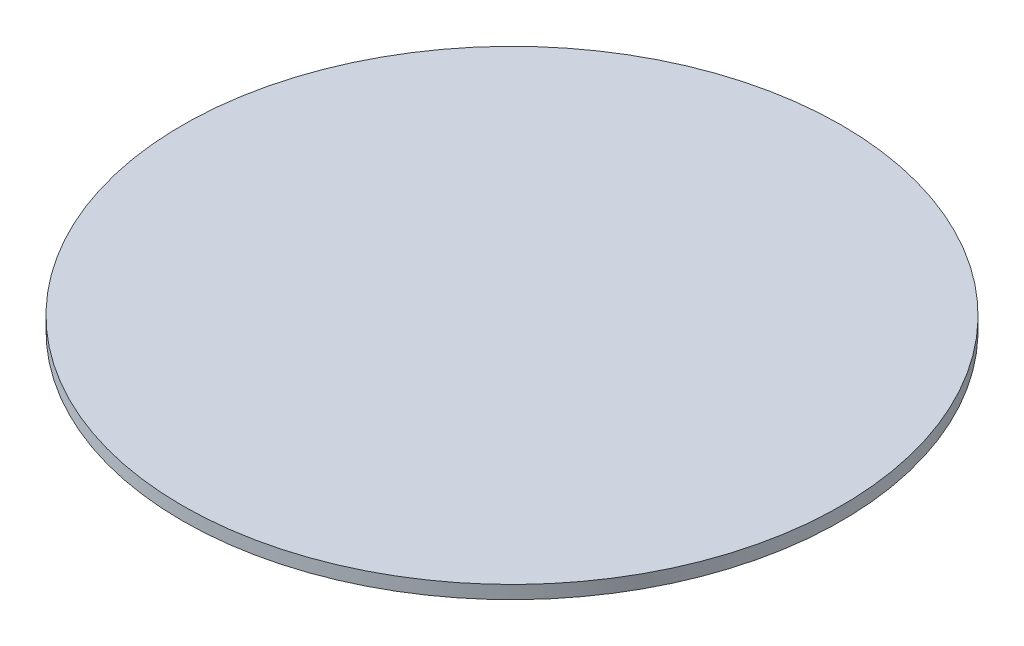
ISO-10303-21;
HEADER;
FILE_DESCRIPTION(('STEP AP214'),'2;1');
FILE_NAME('part.step','',(''),(''),'','','');
FILE_SCHEMA(('AUTOMOTIVE_DESIGN { 1 0 10303 214 1 1 1 1 }'));
ENDSEC;
DATA;
#1=APPLICATION_CONTEXT('core data for automotive mechanical design processes');
#2=APPLICATION_PROTOCOL_DEFINITION('international standard','automotive_design',2000,#1);
#3=PRODUCT_CONTEXT('',#1,'mechanical');
#4=PRODUCT('Part','Part','',(#3));
#5=PRODUCT_RELATED_PRODUCT_CATEGORY('part','',(#4));
#6=PRODUCT_DEFINITION_FORMATION('','',#4);
#7=PRODUCT_DEFINITION_CONTEXT('part definition',#1,'design');
#8=PRODUCT_DEFINITION('design','',#6,#7);
#9=PRODUCT_DEFINITION_SHAPE('','',#8);
#10=(LENGTH_UNIT() NAMED_UNIT(*) SI_UNIT(.MILLI.,.METRE.));
#11=(NAMED_UNIT(*) PLANE_ANGLE_UNIT() SI_UNIT($,.RADIAN.));
#12=(NAMED_UNIT(*) SI_UNIT($,.STERADIAN.) SOLID_ANGLE_UNIT());
#13=UNCERTAINTY_MEASURE_WITH_UNIT(LENGTH_MEASURE(1.E-05),#10,'distance_accuracy_value','');
#14=(GEOMETRIC_REPRESENTATION_CONTEXT(3) GLOBAL_UNCERTAINTY_ASSIGNED_CONTEXT((#13)) GLOBAL_UNIT_ASSIGNED_CONTEXT((#10,
#11,#12)) REPRESENTATION_CONTEXT('',''));
#15=CARTESIAN_POINT('',(0.,0.,0.));
#16=DIRECTION('',(0.,0.,1.));
#17=DIRECTION('',(1.,0.,0.));
#18=AXIS2_PLACEMENT_3D('',#15,#16,#17);
#19=CARTESIAN_POINT('',(0.,10.,0.));
#20=DIRECTION('',(0.,-1.,0.));
#21=DIRECTION('',(0.,0.,-1.));
#22=AXIS2_PLACEMENT_3D('',#19,#20,#21);
#23=CYLINDRICAL_SURFACE('',#22,250.);
#24=CARTESIAN_POINT('',(0.,10.,0.));
#25=DIRECTION('',(0.,1.,0.));
#26=DIRECTION('',(0.,0.,1.));
#27=AXIS2_PLACEMENT_3D('',#24,#25,#26);
#28=CIRCLE('',#27,250.);
#29=CARTESIAN_POINT('',(0.,10.,250.));
#30=VERTEX_POINT('',#29);
#31=EDGE_CURVE('E10',#30,#30,#28,.T.);
#32=ORIENTED_EDGE('',*,*,#31,.F.);
#33=EDGE_LOOP('',(#32));
#34=FACE_BOUND('',#33,.T.);
#35=CARTESIAN_POINT('',(0.,0.,0.));
#36=DIRECTION('',(0.,1.,0.));
#37=DIRECTION('',(0.,0.,1.));
#38=AXIS2_PLACEMENT_3D('',#35,#36,#37);
#39=CIRCLE('',#38,250.);
#40=CARTESIAN_POINT('',(0.,0.,250.));
#41=VERTEX_POINT('',#40);
#42=EDGE_CURVE('E40',#41,#41,#39,.T.);
#43=ORIENTED_EDGE('',*,*,#42,.T.);
#44=EDGE_LOOP('',(#43));
#45=FACE_BOUND('',#44,.T.);
#46=ADVANCED_FACE('F37',(#34,#45),#23,.T.);
#47=CARTESIAN_POINT('',(0.,10.,0.));
#48=DIRECTION('',(0.,1.,0.));
#49=DIRECTION('',(0.,0.,1.));
#50=AXIS2_PLACEMENT_3D('',#47,#48,#49);
#51=PLANE('',#50);
#52=ORIENTED_EDGE('',*,*,#31,.T.);
#53=EDGE_LOOP('',(#52));
#54=FACE_BOUND('',#53,.T.);
#55=ADVANCED_FACE('F54',(#54),#51,.T.);
#56=CARTESIAN_POINT('',(0.,0.,0.));
#57=DIRECTION('',(0.,1.,0.));
#58=DIRECTION('',(0.,0.,1.));
#59=AXIS2_PLACEMENT_3D('',#56,#57,#58);
#60=PLANE('',#59);
#61=ORIENTED_EDGE('',*,*,#42,.F.);
#62=EDGE_LOOP('',(#61));
#63=FACE_BOUND('',#62,.T.);
#64=ADVANCED_FACE('F52',(#63),#60,.F.);
#65=CLOSED_SHELL('',(#46,#55,#64));
#66=MANIFOLD_SOLID_BREP('B2',#65);
#67=ADVANCED_BREP_SHAPE_REPRESENTATION('',(#18,#66),#14);
#68=SHAPE_DEFINITION_REPRESENTATION(#9,#67);
ENDSEC;
END-ISO-10303-21;
